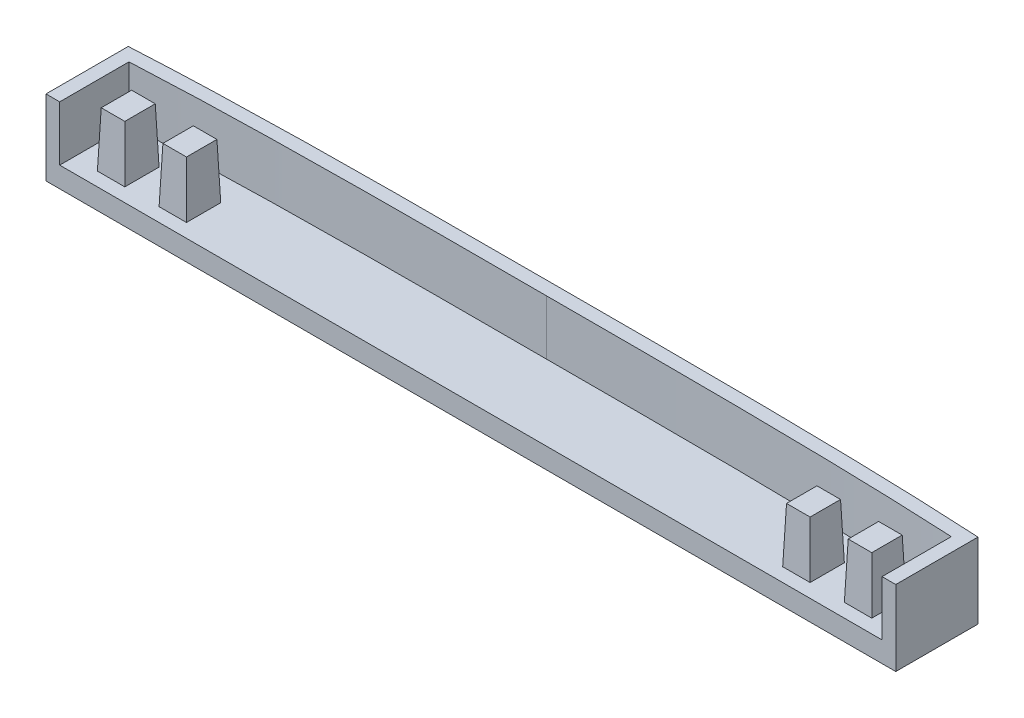
ISO-10303-21;
HEADER;
FILE_DESCRIPTION(('STEP AP214'),'2;1');
FILE_NAME('part.step','',(''),(''),'','','');
FILE_SCHEMA(('AUTOMOTIVE_DESIGN { 1 0 10303 214 1 1 1 1 }'));
ENDSEC;
DATA;
#1=APPLICATION_CONTEXT('core data for automotive mechanical design processes');
#2=APPLICATION_PROTOCOL_DEFINITION('international standard','automotive_design',2000,#1);
#3=PRODUCT_CONTEXT('',#1,'mechanical');
#4=PRODUCT('Part','Part','',(#3));
#5=PRODUCT_RELATED_PRODUCT_CATEGORY('part','',(#4));
#6=PRODUCT_DEFINITION_FORMATION('','',#4);
#7=PRODUCT_DEFINITION_CONTEXT('part definition',#1,'design');
#8=PRODUCT_DEFINITION('design','',#6,#7);
#9=PRODUCT_DEFINITION_SHAPE('','',#8);
#10=(LENGTH_UNIT() NAMED_UNIT(*) SI_UNIT(.MILLI.,.METRE.));
#11=(NAMED_UNIT(*) PLANE_ANGLE_UNIT() SI_UNIT($,.RADIAN.));
#12=(NAMED_UNIT(*) SI_UNIT($,.STERADIAN.) SOLID_ANGLE_UNIT());
#13=UNCERTAINTY_MEASURE_WITH_UNIT(LENGTH_MEASURE(1.E-05),#10,'distance_accuracy_value','');
#14=(GEOMETRIC_REPRESENTATION_CONTEXT(3) GLOBAL_UNCERTAINTY_ASSIGNED_CONTEXT((#13)) GLOBAL_UNIT_ASSIGNED_CONTEXT((#10,
#11,#12)) REPRESENTATION_CONTEXT('',''));
#15=CARTESIAN_POINT('',(0.,0.,0.));
#16=DIRECTION('',(0.,0.,1.));
#17=DIRECTION('',(1.,0.,0.));
#18=AXIS2_PLACEMENT_3D('',#15,#16,#17);
#19=CARTESIAN_POINT('',(-15.2954762235644,1.5,-6.45792529669851));
#20=DIRECTION('',(0.,1.,0.));
#21=DIRECTION('',(0.,0.,1.));
#22=AXIS2_PLACEMENT_3D('',#19,#20,#21);
#23=PLANE('',#22);
#24=DIRECTION('',(0.,0.,1.));
#25=VECTOR('',#24,1.);
#26=CARTESIAN_POINT('',(-30.,1.5,0.));
#27=LINE('',#26,#25);
#28=CARTESIAN_POINT('',(-30.,1.5,-5.05300690395027));
#29=VERTEX_POINT('',#28);
#30=CARTESIAN_POINT('',(-30.,1.5,0.));
#31=VERTEX_POINT('',#30);
#32=EDGE_CURVE('E408',#29,#31,#27,.T.);
#33=ORIENTED_EDGE('',*,*,#32,.T.);
#34=DIRECTION('',(-1.,0.,0.));
#35=VECTOR('',#34,1.);
#36=CARTESIAN_POINT('',(-30.,1.5,0.));
#37=LINE('',#36,#35);
#38=CARTESIAN_POINT('',(30.,1.5,0.));
#39=VERTEX_POINT('',#38);
#40=EDGE_CURVE('E401',#39,#31,#37,.T.);
#41=ORIENTED_EDGE('',*,*,#40,.F.);
#42=DIRECTION('',(0.,0.,-1.));
#43=VECTOR('',#42,1.);
#44=CARTESIAN_POINT('',(30.,1.5,0.));
#45=LINE('',#44,#43);
#46=CARTESIAN_POINT('',(30.,1.5,-5.05300690395027));
#47=VERTEX_POINT('',#46);
#48=EDGE_CURVE('E600',#39,#47,#45,.T.);
#49=ORIENTED_EDGE('',*,*,#48,.T.);
#50=CARTESIAN_POINT('',(30.,1.5,-5.05300690395027));
#51=CARTESIAN_POINT('',(29.6232980407042,1.5,-5.07265387252963));
#52=CARTESIAN_POINT('',(29.2465447851836,1.5,-5.09129270729749));
#53=CARTESIAN_POINT('',(28.4929531974639,1.5,-5.12672538045867));
#54=CARTESIAN_POINT('',(28.1161148656819,1.5,-5.14351922770714));
#55=CARTESIAN_POINT('',(26.9855117739003,1.5,-5.19138966924782));
#56=CARTESIAN_POINT('',(26.2316402548718,1.5,-5.21995611962589));
#57=CARTESIAN_POINT('',(24.7237960436403,1.5,-5.27147777957774));
#58=CARTESIAN_POINT('',(23.9698233731149,1.5,-5.2944336355481));
#59=CARTESIAN_POINT('',(22.461744786003,1.5,-5.33558882579871));
#60=CARTESIAN_POINT('',(21.7076388685329,1.5,-5.3537881272502));
#61=CARTESIAN_POINT('',(19.4453494050499,1.5,-5.40233176543027));
#62=CARTESIAN_POINT('',(17.9370352141215,1.5,-5.42662694769469));
#63=CARTESIAN_POINT('',(15.6744297417583,1.5,-5.45430549435337));
#64=CARTESIAN_POINT('',(14.9201840806281,1.5,-5.46207106841785));
#65=CARTESIAN_POINT('',(13.4116704608632,1.5,-5.47512736376247));
#66=CARTESIAN_POINT('',(12.6574025022247,1.5,-5.48041808461608));
#67=CARTESIAN_POINT('',(10.9111604434151,1.5,-5.49031099250601));
#68=CARTESIAN_POINT('',(9.91918234830561,1.5,-5.49417079135637));
#69=CARTESIAN_POINT('',(7.93521857787648,1.5,-5.49933276132543));
#70=CARTESIAN_POINT('',(6.94323290254634,1.5,-5.50063492780819));
#71=CARTESIAN_POINT('',(4.95937014869328,1.5,-5.50169301140521));
#72=CARTESIAN_POINT('',(3.96749307019953,1.5,-5.50144909819254));
#73=CARTESIAN_POINT('',(2.47968008228865,1.5,-5.50081831331378));
#74=CARTESIAN_POINT('',(1.98374405661157,1.5,-5.50056390011262));
#75=CARTESIAN_POINT('',(0.991872045339383,1.5,-5.50015747385048));
#76=CARTESIAN_POINT('',(0.495936059744291,1.5,-5.50000546077392));
#77=CARTESIAN_POINT('',(0.,1.5,-5.5));
#78=B_SPLINE_CURVE_WITH_KNOTS('',3,(#50,#51,#52,#53,#54,#55,#56,#57,#58,#59,#60,#61,#62,#63,#64,
#65,#66,#67,#68,#69,#70,#71,#72,#73,#74,#75,#76,#77),.UNSPECIFIED.,.F.,.F.,(4,2,2,2,2,2,2,2,2,2,
2,2,2,4),(0.,1.13163847193436,2.26327151224468,4.52648153383311,6.78943068794618,
9.05239546004916,13.5778479837032,15.8407030805466,18.1035585673908,21.0795107118779,
24.0554682505474,27.0310992011955,28.5189074845874,30.006715541544),.UNSPECIFIED.);
#79=CARTESIAN_POINT('',(0.,1.5,-5.5));
#80=VERTEX_POINT('',#79);
#81=EDGE_CURVE('E446',#47,#80,#78,.T.);
#82=ORIENTED_EDGE('',*,*,#81,.T.);
#83=CARTESIAN_POINT('',(0.,1.5,-5.5));
#84=CARTESIAN_POINT('',(-0.754204279511448,1.5,-5.50002788536174));
#85=CARTESIAN_POINT('',(-1.50840846300501,1.5,-5.50036349450039));
#86=CARTESIAN_POINT('',(-3.01681750470305,1.5,-5.50105026444585));
#87=CARTESIAN_POINT('',(-3.77102236290753,1.5,-5.50140142526667));
#88=CARTESIAN_POINT('',(-5.27947991986144,1.5,-5.50151940420532));
#89=CARTESIAN_POINT('',(-6.03373261862238,1.5,-5.50128618539688));
#90=CARTESIAN_POINT('',(-7.54223717497706,1.5,-5.499760152417));
#91=CARTESIAN_POINT('',(-8.2964890325708,1.5,-5.49846733821871));
#92=CARTESIAN_POINT('',(-9.8049967797207,1.5,-5.49437998246243));
#93=CARTESIAN_POINT('',(-10.5592526692377,1.5,-5.49158542535111));
#94=CARTESIAN_POINT('',(-12.0677543404704,1.5,-5.48407115406916));
#95=CARTESIAN_POINT('',(-12.8220001221967,1.5,-5.47935144210508));
#96=CARTESIAN_POINT('',(-14.3304411697333,1.5,-5.46755713596137));
#97=CARTESIAN_POINT('',(-15.0846364363177,1.5,-5.46048264359941));
#98=CARTESIAN_POINT('',(-16.5929992746815,1.5,-5.44352228697971));
#99=CARTESIAN_POINT('',(-17.3471668463157,1.5,-5.43363640964496));
#100=CARTESIAN_POINT('',(-19.0932055686142,1.5,-5.40691581678413));
#101=CARTESIAN_POINT('',(-20.0850587579115,1.5,-5.38887295508633));
#102=CARTESIAN_POINT('',(-22.0686061011535,1.5,-5.34573969271648));
#103=CARTESIAN_POINT('',(-23.0603002567394,1.5,-5.32064937017528));
#104=CARTESIAN_POINT('',(-24.5477207475729,1.5,-5.27646727541013));
#105=CARTESIAN_POINT('',(-25.0435448606046,1.5,-5.26064736796153));
#106=CARTESIAN_POINT('',(-26.0351083350196,1.5,-5.22656364850213));
#107=CARTESIAN_POINT('',(-26.5308476966237,1.5,-5.20829984295561));
#108=CARTESIAN_POINT('',(-27.5222389036597,1.5,-5.16903650723192));
#109=CARTESIAN_POINT('',(-28.0178907447721,1.5,-5.14803686710011));
#110=CARTESIAN_POINT('',(-29.0090576214853,1.5,-5.10293781222904));
#111=CARTESIAN_POINT('',(-29.504572655771,1.5,-5.07883836866203));
#112=CARTESIAN_POINT('',(-30.,1.5,-5.05300690395027));
#113=B_SPLINE_CURVE_WITH_KNOTS('',3,(#83,#84,#85,#86,#87,#88,#89,#90,#91,#92,#93,#94,#95,#96,
#97,#98,#99,#100,#101,#102,#103,#104,#105,#106,#107,#108,#109,#110,#111,#112),.UNSPECIFIED.,.F.,
.F.,(4,2,2,2,2,2,2,2,2,2,2,2,2,2,4),(0.,2.26261275440981,4.52522754800911,6.78798531724404,
9.05074314383125,11.3135244059297,13.5763030745085,15.8389839161692,18.1016752827412,
21.0777077795027,24.0537072841258,25.5419316332777,27.0301520460505,28.5184322896486,
30.0067263750507),.UNSPECIFIED.);
#114=EDGE_CURVE('E595',#80,#29,#113,.T.);
#115=ORIENTED_EDGE('',*,*,#114,.T.);
#116=EDGE_LOOP('',(#33,#41,#49,#82,#115));
#117=FACE_BOUND('',#116,.T.);
#118=DIRECTION('',(1.,0.,0.));
#119=VECTOR('',#118,1.);
#120=CARTESIAN_POINT('',(-28.25,1.5,-0.999999999999992));
#121=LINE('',#120,#119);
#122=CARTESIAN_POINT('',(-28.25,1.5,-0.999999999999992));
#123=VERTEX_POINT('',#122);
#124=CARTESIAN_POINT('',(-26.25,1.5,-0.999999999999993));
#125=VERTEX_POINT('',#124);
#126=EDGE_CURVE('E359',#123,#125,#121,.T.);
#127=ORIENTED_EDGE('',*,*,#126,.F.);
#128=DIRECTION('',(0.,0.,1.));
#129=VECTOR('',#128,1.);
#130=CARTESIAN_POINT('',(-28.25,1.5,-3.49999999999999));
#131=LINE('',#130,#129);
#132=CARTESIAN_POINT('',(-28.25,1.5,-3.49999999999999));
#133=VERTEX_POINT('',#132);
#134=EDGE_CURVE('E332',#133,#123,#131,.T.);
#135=ORIENTED_EDGE('',*,*,#134,.F.);
#136=DIRECTION('',(-1.,0.,0.));
#137=VECTOR('',#136,1.);
#138=CARTESIAN_POINT('',(-28.25,1.5,-3.49999999999999));
#139=LINE('',#138,#137);
#140=CARTESIAN_POINT('',(-26.25,1.5,-3.49999999999999));
#141=VERTEX_POINT('',#140);
#142=EDGE_CURVE('E366',#141,#133,#139,.T.);
#143=ORIENTED_EDGE('',*,*,#142,.F.);
#144=DIRECTION('',(0.,0.,-1.));
#145=VECTOR('',#144,1.);
#146=CARTESIAN_POINT('',(-26.25,1.5,-3.49999999999999));
#147=LINE('',#146,#145);
#148=EDGE_CURVE('E362',#125,#141,#147,.T.);
#149=ORIENTED_EDGE('',*,*,#148,.F.);
#150=EDGE_LOOP('',(#127,#135,#143,#149));
#151=FACE_BOUND('',#150,.T.);
#152=DIRECTION('',(1.,0.,0.));
#153=VECTOR('',#152,1.);
#154=CARTESIAN_POINT('',(-23.75,1.5,-0.999999999999992));
#155=LINE('',#154,#153);
#156=CARTESIAN_POINT('',(-23.75,1.5,-0.999999999999992));
#157=VERTEX_POINT('',#156);
#158=CARTESIAN_POINT('',(-21.75,1.5,-0.999999999999992));
#159=VERTEX_POINT('',#158);
#160=EDGE_CURVE('E318',#157,#159,#155,.T.);
#161=ORIENTED_EDGE('',*,*,#160,.F.);
#162=DIRECTION('',(0.,0.,1.));
#163=VECTOR('',#162,1.);
#164=CARTESIAN_POINT('',(-23.75,1.5,-3.49999999999999));
#165=LINE('',#164,#163);
#166=CARTESIAN_POINT('',(-23.75,1.5,-3.49999999999999));
#167=VERTEX_POINT('',#166);
#168=EDGE_CURVE('E292',#167,#157,#165,.T.);
#169=ORIENTED_EDGE('',*,*,#168,.F.);
#170=DIRECTION('',(-1.,0.,0.));
#171=VECTOR('',#170,1.);
#172=CARTESIAN_POINT('',(-23.75,1.5,-3.49999999999999));
#173=LINE('',#172,#171);
#174=CARTESIAN_POINT('',(-21.75,1.5,-3.49999999999999));
#175=VERTEX_POINT('',#174);
#176=EDGE_CURVE('E325',#175,#167,#173,.T.);
#177=ORIENTED_EDGE('',*,*,#176,.F.);
#178=DIRECTION('',(0.,0.,-1.));
#179=VECTOR('',#178,1.);
#180=CARTESIAN_POINT('',(-21.75,1.5,-3.49999999999999));
#181=LINE('',#180,#179);
#182=EDGE_CURVE('E321',#159,#175,#181,.T.);
#183=ORIENTED_EDGE('',*,*,#182,.F.);
#184=EDGE_LOOP('',(#161,#169,#177,#183));
#185=FACE_BOUND('',#184,.T.);
#186=DIRECTION('',(0.,0.,1.));
#187=VECTOR('',#186,1.);
#188=CARTESIAN_POINT('',(21.75,1.5,-3.5));
#189=LINE('',#188,#187);
#190=CARTESIAN_POINT('',(21.75,1.5,-3.5));
#191=VERTEX_POINT('',#190);
#192=CARTESIAN_POINT('',(21.75,1.5,-0.999999999999998));
#193=VERTEX_POINT('',#192);
#194=EDGE_CURVE('E279',#191,#193,#189,.T.);
#195=ORIENTED_EDGE('',*,*,#194,.F.);
#196=DIRECTION('',(-1.,0.,0.));
#197=VECTOR('',#196,1.);
#198=CARTESIAN_POINT('',(23.75,1.5,-3.5));
#199=LINE('',#198,#197);
#200=CARTESIAN_POINT('',(23.75,1.5,-3.5));
#201=VERTEX_POINT('',#200);
#202=EDGE_CURVE('E236',#201,#191,#199,.T.);
#203=ORIENTED_EDGE('',*,*,#202,.F.);
#204=DIRECTION('',(0.,0.,-1.));
#205=VECTOR('',#204,1.);
#206=CARTESIAN_POINT('',(23.75,1.5,-3.5));
#207=LINE('',#206,#205);
#208=CARTESIAN_POINT('',(23.75,1.5,-0.999999999999998));
#209=VERTEX_POINT('',#208);
#210=EDGE_CURVE('E285',#209,#201,#207,.T.);
#211=ORIENTED_EDGE('',*,*,#210,.F.);
#212=DIRECTION('',(1.,0.,0.));
#213=VECTOR('',#212,1.);
#214=CARTESIAN_POINT('',(23.75,1.5,-0.999999999999998));
#215=LINE('',#214,#213);
#216=EDGE_CURVE('E282',#193,#209,#215,.T.);
#217=ORIENTED_EDGE('',*,*,#216,.F.);
#218=EDGE_LOOP('',(#195,#203,#211,#217));
#219=FACE_BOUND('',#218,.T.);
#220=DIRECTION('',(0.,0.,1.));
#221=VECTOR('',#220,1.);
#222=CARTESIAN_POINT('',(26.25,1.5,-3.5));
#223=LINE('',#222,#221);
#224=CARTESIAN_POINT('',(26.25,1.5,-3.5));
#225=VERTEX_POINT('',#224);
#226=CARTESIAN_POINT('',(26.25,1.5,-0.999999999999999));
#227=VERTEX_POINT('',#226);
#228=EDGE_CURVE('E229',#225,#227,#223,.T.);
#229=ORIENTED_EDGE('',*,*,#228,.F.);
#230=DIRECTION('',(-1.,0.,0.));
#231=VECTOR('',#230,1.);
#232=CARTESIAN_POINT('',(28.25,1.5,-3.49999999999999));
#233=LINE('',#232,#231);
#234=CARTESIAN_POINT('',(28.25,1.5,-3.49999999999999));
#235=VERTEX_POINT('',#234);
#236=EDGE_CURVE('E241',#235,#225,#233,.T.);
#237=ORIENTED_EDGE('',*,*,#236,.F.);
#238=DIRECTION('',(0.,0.,-1.));
#239=VECTOR('',#238,1.);
#240=CARTESIAN_POINT('',(28.25,1.5,-3.49999999999999));
#241=LINE('',#240,#239);
#242=CARTESIAN_POINT('',(28.25,1.5,-0.999999999999992));
#243=VERTEX_POINT('',#242);
#244=EDGE_CURVE('E254',#243,#235,#241,.T.);
#245=ORIENTED_EDGE('',*,*,#244,.F.);
#246=DIRECTION('',(1.,0.,0.));
#247=VECTOR('',#246,1.);
#248=CARTESIAN_POINT('',(28.25,1.5,-0.999999999999992));
#249=LINE('',#248,#247);
#250=EDGE_CURVE('E250',#227,#243,#249,.T.);
#251=ORIENTED_EDGE('',*,*,#250,.F.);
#252=EDGE_LOOP('',(#229,#237,#245,#251));
#253=FACE_BOUND('',#252,.T.);
#254=ADVANCED_FACE('F49',(#117,#151,#185,#219,#253),#23,.T.);
#255=CARTESIAN_POINT('',(-31.,5.5,0.));
#256=DIRECTION('',(1.,0.,0.));
#257=DIRECTION('',(0.,0.,-1.));
#258=AXIS2_PLACEMENT_3D('',#255,#256,#257);
#259=PLANE('',#258);
#260=DIRECTION('',(0.,0.,1.));
#261=VECTOR('',#260,1.);
#262=CARTESIAN_POINT('',(-31.,0.,0.));
#263=LINE('',#262,#261);
#264=CARTESIAN_POINT('',(-31.,0.,-5.99999999999999));
#265=VERTEX_POINT('',#264);
#266=CARTESIAN_POINT('',(-31.,0.,0.));
#267=VERTEX_POINT('',#266);
#268=EDGE_CURVE('E620',#265,#267,#263,.T.);
#269=ORIENTED_EDGE('',*,*,#268,.T.);
#270=DIRECTION('',(0.,-1.,0.));
#271=VECTOR('',#270,1.);
#272=CARTESIAN_POINT('',(-31.,5.5,0.));
#273=LINE('',#272,#271);
#274=CARTESIAN_POINT('',(-31.,5.5,0.));
#275=VERTEX_POINT('',#274);
#276=EDGE_CURVE('E11',#275,#267,#273,.T.);
#277=ORIENTED_EDGE('',*,*,#276,.F.);
#278=DIRECTION('',(0.,0.,1.));
#279=VECTOR('',#278,1.);
#280=CARTESIAN_POINT('',(-31.,5.5,0.));
#281=LINE('',#280,#279);
#282=CARTESIAN_POINT('',(-31.,5.5,-5.99999999999999));
#283=VERTEX_POINT('',#282);
#284=EDGE_CURVE('E918',#283,#275,#281,.T.);
#285=ORIENTED_EDGE('',*,*,#284,.F.);
#286=DIRECTION('',(0.,-1.,0.));
#287=VECTOR('',#286,1.);
#288=CARTESIAN_POINT('',(-31.,5.5,-5.99999999999999));
#289=LINE('',#288,#287);
#290=EDGE_CURVE('E911',#283,#265,#289,.T.);
#291=ORIENTED_EDGE('',*,*,#290,.T.);
#292=EDGE_LOOP('',(#269,#277,#285,#291));
#293=FACE_BOUND('',#292,.T.);
#294=ADVANCED_FACE('F51',(#293),#259,.F.);
#295=CARTESIAN_POINT('',(31.,5.5,0.));
#296=DIRECTION('',(0.,0.,-1.));
#297=DIRECTION('',(-1.,0.,0.));
#298=AXIS2_PLACEMENT_3D('',#295,#296,#297);
#299=PLANE('',#298);
#300=ORIENTED_EDGE('',*,*,#40,.T.);
#301=DIRECTION('',(0.,1.,0.));
#302=VECTOR('',#301,1.);
#303=CARTESIAN_POINT('',(-30.,-58.5187470712277,0.));
#304=LINE('',#303,#302);
#305=CARTESIAN_POINT('',(-30.,5.5,0.));
#306=VERTEX_POINT('',#305);
#307=EDGE_CURVE('E373',#31,#306,#304,.T.);
#308=ORIENTED_EDGE('',*,*,#307,.T.);
#309=DIRECTION('',(1.,0.,0.));
#310=VECTOR('',#309,1.);
#311=CARTESIAN_POINT('',(31.,5.5,0.));
#312=LINE('',#311,#310);
#313=EDGE_CURVE('E930',#275,#306,#312,.T.);
#314=ORIENTED_EDGE('',*,*,#313,.F.);
#315=ORIENTED_EDGE('',*,*,#276,.T.);
#316=DIRECTION('',(1.,0.,0.));
#317=VECTOR('',#316,1.);
#318=CARTESIAN_POINT('',(31.,0.,0.));
#319=LINE('',#318,#317);
#320=CARTESIAN_POINT('',(31.,0.,0.));
#321=VERTEX_POINT('',#320);
#322=EDGE_CURVE('E625',#267,#321,#319,.T.);
#323=ORIENTED_EDGE('',*,*,#322,.T.);
#324=DIRECTION('',(0.,-1.,0.));
#325=VECTOR('',#324,1.);
#326=CARTESIAN_POINT('',(31.,5.5,0.));
#327=LINE('',#326,#325);
#328=CARTESIAN_POINT('',(31.,5.5,0.));
#329=VERTEX_POINT('',#328);
#330=EDGE_CURVE('E58',#329,#321,#327,.T.);
#331=ORIENTED_EDGE('',*,*,#330,.F.);
#332=CARTESIAN_POINT('',(30.,5.5,0.));
#333=VERTEX_POINT('',#332);
#334=EDGE_CURVE('E608',#333,#329,#312,.T.);
#335=ORIENTED_EDGE('',*,*,#334,.F.);
#336=DIRECTION('',(0.,1.,0.));
#337=VECTOR('',#336,1.);
#338=CARTESIAN_POINT('',(30.,-58.5187470712277,0.));
#339=LINE('',#338,#337);
#340=EDGE_CURVE('E397',#39,#333,#339,.T.);
#341=ORIENTED_EDGE('',*,*,#340,.F.);
#342=EDGE_LOOP('',(#300,#308,#314,#315,#323,#331,#335,#341));
#343=FACE_BOUND('',#342,.T.);
#344=ADVANCED_FACE('F554',(#343),#299,.F.);
#345=CARTESIAN_POINT('',(31.,5.5,0.));
#346=DIRECTION('',(-1.,0.,0.));
#347=DIRECTION('',(0.,0.,1.));
#348=AXIS2_PLACEMENT_3D('',#345,#346,#347);
#349=PLANE('',#348);
#350=DIRECTION('',(0.,0.,-1.));
#351=VECTOR('',#350,1.);
#352=CARTESIAN_POINT('',(31.,0.,0.));
#353=LINE('',#352,#351);
#354=CARTESIAN_POINT('',(31.,0.,-6.));
#355=VERTEX_POINT('',#354);
#356=EDGE_CURVE('E926',#321,#355,#353,.T.);
#357=ORIENTED_EDGE('',*,*,#356,.T.);
#358=DIRECTION('',(0.,-1.,0.));
#359=VECTOR('',#358,1.);
#360=CARTESIAN_POINT('',(31.,5.5,-6.));
#361=LINE('',#360,#359);
#362=CARTESIAN_POINT('',(31.,5.5,-6.));
#363=VERTEX_POINT('',#362);
#364=EDGE_CURVE('E954',#363,#355,#361,.T.);
#365=ORIENTED_EDGE('',*,*,#364,.F.);
#366=DIRECTION('',(0.,0.,-1.));
#367=VECTOR('',#366,1.);
#368=CARTESIAN_POINT('',(31.,5.5,0.));
#369=LINE('',#368,#367);
#370=EDGE_CURVE('E416',#329,#363,#369,.T.);
#371=ORIENTED_EDGE('',*,*,#370,.F.);
#372=ORIENTED_EDGE('',*,*,#330,.T.);
#373=EDGE_LOOP('',(#357,#365,#371,#372));
#374=FACE_BOUND('',#373,.T.);
#375=ADVANCED_FACE('F431',(#374),#349,.F.);
#376=CARTESIAN_POINT('',(31.,5.5,-6.));
#377=CARTESIAN_POINT('',(21.2515523068222,5.5,-6.55446745786269));
#378=CARTESIAN_POINT('',(9.20305095601617,5.5,-6.5));
#379=CARTESIAN_POINT('',(0.,5.5,-6.5));
#380=B_SPLINE_CURVE_WITH_KNOTS('',3,(#376,#377,#378,#379),.UNSPECIFIED.,.F.,.F.,(4,4),(0.,1.),.UNSPECIFIED.);
#381=DIRECTION('',(0.,-1.,0.));
#382=VECTOR('',#381,1.);
#383=SURFACE_OF_LINEAR_EXTRUSION('',#380,#382);
#384=CARTESIAN_POINT('',(31.,0.,-6.));
#385=CARTESIAN_POINT('',(21.2515523068222,0.,-6.55446745786269));
#386=CARTESIAN_POINT('',(9.20305095601617,0.,-6.5));
#387=CARTESIAN_POINT('',(0.,0.,-6.5));
#388=B_SPLINE_CURVE_WITH_KNOTS('',3,(#384,#385,#386,#387),.UNSPECIFIED.,.F.,.F.,(4,4),(0.,1.),.UNSPECIFIED.);
#389=CARTESIAN_POINT('',(0.,0.,-6.5));
#390=VERTEX_POINT('',#389);
#391=EDGE_CURVE('E919',#355,#390,#388,.T.);
#392=ORIENTED_EDGE('',*,*,#391,.T.);
#393=DIRECTION('',(0.,-1.,0.));
#394=VECTOR('',#393,1.);
#395=CARTESIAN_POINT('',(0.,5.5,-6.5));
#396=LINE('',#395,#394);
#397=CARTESIAN_POINT('',(0.,5.5,-6.5));
#398=VERTEX_POINT('',#397);
#399=EDGE_CURVE('E914',#398,#390,#396,.T.);
#400=ORIENTED_EDGE('',*,*,#399,.F.);
#401=EDGE_CURVE('E409',#363,#398,#380,.T.);
#402=ORIENTED_EDGE('',*,*,#401,.F.);
#403=ORIENTED_EDGE('',*,*,#364,.T.);
#404=EDGE_LOOP('',(#392,#400,#402,#403));
#405=FACE_BOUND('',#404,.T.);
#406=ADVANCED_FACE('F425',(#405),#383,.F.);
#407=CARTESIAN_POINT('',(0.,5.5,-6.5));
#408=CARTESIAN_POINT('',(-9.20305095601617,5.5,-6.5));
#409=CARTESIAN_POINT('',(-21.2515523068222,5.5,-6.55446745786269));
#410=CARTESIAN_POINT('',(-31.,5.5,-5.99999999999999));
#411=B_SPLINE_CURVE_WITH_KNOTS('',3,(#407,#408,#409,#410),.UNSPECIFIED.,.F.,.F.,(4,4),(0.,1.),.UNSPECIFIED.);
#412=DIRECTION('',(0.,-1.,0.));
#413=VECTOR('',#412,1.);
#414=SURFACE_OF_LINEAR_EXTRUSION('',#411,#413);
#415=CARTESIAN_POINT('',(0.,0.,-6.5));
#416=CARTESIAN_POINT('',(-9.20305095601617,0.,-6.5));
#417=CARTESIAN_POINT('',(-21.2515523068222,0.,-6.55446745786269));
#418=CARTESIAN_POINT('',(-31.,0.,-5.99999999999999));
#419=B_SPLINE_CURVE_WITH_KNOTS('',3,(#415,#416,#417,#418),.UNSPECIFIED.,.F.,.F.,(4,4),(0.,1.),.UNSPECIFIED.);
#420=EDGE_CURVE('E908',#390,#265,#419,.T.);
#421=ORIENTED_EDGE('',*,*,#420,.T.);
#422=ORIENTED_EDGE('',*,*,#290,.F.);
#423=EDGE_CURVE('E415',#398,#283,#411,.T.);
#424=ORIENTED_EDGE('',*,*,#423,.F.);
#425=ORIENTED_EDGE('',*,*,#399,.T.);
#426=EDGE_LOOP('',(#421,#422,#424,#425));
#427=FACE_BOUND('',#426,.T.);
#428=ADVANCED_FACE('F430',(#427),#414,.F.);
#429=CARTESIAN_POINT('',(-15.2954762235644,5.5,-6.45792529669851));
#430=DIRECTION('',(0.,1.,0.));
#431=DIRECTION('',(0.,0.,1.));
#432=AXIS2_PLACEMENT_3D('',#429,#430,#431);
#433=PLANE('',#432);
#434=ORIENTED_EDGE('',*,*,#313,.T.);
#435=DIRECTION('',(0.,0.,1.));
#436=VECTOR('',#435,1.);
#437=CARTESIAN_POINT('',(-30.,5.5,0.));
#438=LINE('',#437,#436);
#439=CARTESIAN_POINT('',(-30.,5.5,-5.05300690395027));
#440=VERTEX_POINT('',#439);
#441=EDGE_CURVE('E603',#440,#306,#438,.T.);
#442=ORIENTED_EDGE('',*,*,#441,.F.);
#443=CARTESIAN_POINT('',(0.,5.5,-5.5));
#444=CARTESIAN_POINT('',(-0.75420427951145,5.5,-5.50002788536174));
#445=CARTESIAN_POINT('',(-1.50840846300501,5.5,-5.50036349450039));
#446=CARTESIAN_POINT('',(-3.01681750470305,5.5,-5.50105026444585));
#447=CARTESIAN_POINT('',(-3.77102236290753,5.5,-5.50140142526667));
#448=CARTESIAN_POINT('',(-5.27947991986144,5.5,-5.50151940420532));
#449=CARTESIAN_POINT('',(-6.03373261862238,5.5,-5.50128618539688));
#450=CARTESIAN_POINT('',(-7.54223717497706,5.5,-5.499760152417));
#451=CARTESIAN_POINT('',(-8.2964890325708,5.5,-5.49846733821871));
#452=CARTESIAN_POINT('',(-9.8049967797207,5.5,-5.49437998246243));
#453=CARTESIAN_POINT('',(-10.5592526692377,5.5,-5.49158542535111));
#454=CARTESIAN_POINT('',(-12.0677543404704,5.5,-5.48407115406916));
#455=CARTESIAN_POINT('',(-12.8220001221967,5.5,-5.47935144210508));
#456=CARTESIAN_POINT('',(-14.3304411697333,5.5,-5.46755713596137));
#457=CARTESIAN_POINT('',(-15.0846364363177,5.5,-5.46048264359941));
#458=CARTESIAN_POINT('',(-16.5929992746815,5.5,-5.44352228697971));
#459=CARTESIAN_POINT('',(-17.3471668463157,5.5,-5.43363640964496));
#460=CARTESIAN_POINT('',(-19.0932055686142,5.5,-5.40691581678413));
#461=CARTESIAN_POINT('',(-20.0850587579115,5.5,-5.38887295508633));
#462=CARTESIAN_POINT('',(-22.0686061011535,5.5,-5.34573969271648));
#463=CARTESIAN_POINT('',(-23.0603002567394,5.5,-5.32064937017528));
#464=CARTESIAN_POINT('',(-24.5477207475729,5.5,-5.27646727541013));
#465=CARTESIAN_POINT('',(-25.0435448606046,5.5,-5.26064736796153));
#466=CARTESIAN_POINT('',(-26.0351083350196,5.5,-5.22656364850213));
#467=CARTESIAN_POINT('',(-26.5308476966237,5.5,-5.20829984295561));
#468=CARTESIAN_POINT('',(-27.5222389036597,5.5,-5.16903650723192));
#469=CARTESIAN_POINT('',(-28.0178907447721,5.5,-5.14803686710011));
#470=CARTESIAN_POINT('',(-29.0090576214853,5.5,-5.10293781222904));
#471=CARTESIAN_POINT('',(-29.504572655771,5.5,-5.07883836866203));
#472=CARTESIAN_POINT('',(-30.,5.5,-5.05300690395027));
#473=B_SPLINE_CURVE_WITH_KNOTS('',3,(#443,#444,#445,#446,#447,#448,#449,#450,#451,#452,#453,
#454,#455,#456,#457,#458,#459,#460,#461,#462,#463,#464,#465,#466,#467,#468,#469,#470,#471,#472),
.UNSPECIFIED.,.F.,.F.,(4,2,2,2,2,2,2,2,2,2,2,2,2,2,4),(0.,2.26261275440981,4.52522754800911,
6.78798531724404,9.05074314383125,11.3135244059297,13.5763030745085,15.8389839161692,
18.1016752827412,21.0777077795027,24.0537072841258,25.5419316332777,27.0301520460505,
28.5184322896486,30.0067263750507),.UNSPECIFIED.);
#474=CARTESIAN_POINT('',(0.,5.5,-5.5));
#475=VERTEX_POINT('',#474);
#476=EDGE_CURVE('E463',#475,#440,#473,.T.);
#477=ORIENTED_EDGE('',*,*,#476,.F.);
#478=CARTESIAN_POINT('',(30.,5.5,-5.05300690395027));
#479=CARTESIAN_POINT('',(29.6232980407042,5.5,-5.07265387252963));
#480=CARTESIAN_POINT('',(29.2465447851836,5.5,-5.0912927072975));
#481=CARTESIAN_POINT('',(28.4929531974639,5.5,-5.12672538045867));
#482=CARTESIAN_POINT('',(28.1161148656819,5.5,-5.14351922770714));
#483=CARTESIAN_POINT('',(26.9855117739003,5.5,-5.19138966924781));
#484=CARTESIAN_POINT('',(26.2316402548718,5.5,-5.21995611962589));
#485=CARTESIAN_POINT('',(24.7237960436404,5.5,-5.27147777957774));
#486=CARTESIAN_POINT('',(23.9698233731149,5.5,-5.2944336355481));
#487=CARTESIAN_POINT('',(22.461744786003,5.5,-5.33558882579871));
#488=CARTESIAN_POINT('',(21.7076388685329,5.5,-5.3537881272502));
#489=CARTESIAN_POINT('',(19.4453494050499,5.5,-5.40233176543027));
#490=CARTESIAN_POINT('',(17.9370352141215,5.5,-5.42662694769469));
#491=CARTESIAN_POINT('',(15.6744297417583,5.5,-5.45430549435337));
#492=CARTESIAN_POINT('',(14.9201840806281,5.5,-5.46207106841785));
#493=CARTESIAN_POINT('',(13.4116704608632,5.5,-5.47512736376247));
#494=CARTESIAN_POINT('',(12.6574025022247,5.5,-5.48041808461608));
#495=CARTESIAN_POINT('',(10.9111604434151,5.5,-5.490310992506));
#496=CARTESIAN_POINT('',(9.91918234830561,5.5,-5.49417079135637));
#497=CARTESIAN_POINT('',(7.93521857787649,5.5,-5.49933276132543));
#498=CARTESIAN_POINT('',(6.94323290254635,5.5,-5.50063492780819));
#499=CARTESIAN_POINT('',(4.95937014869329,5.5,-5.50169301140521));
#500=CARTESIAN_POINT('',(3.96749307019954,5.5,-5.50144909819254));
#501=CARTESIAN_POINT('',(2.47968008228866,5.5,-5.50081831331378));
#502=CARTESIAN_POINT('',(1.98374405661157,5.5,-5.50056390011262));
#503=CARTESIAN_POINT('',(0.991872045339385,5.5,-5.50015747385048));
#504=CARTESIAN_POINT('',(0.495936059744291,5.5,-5.50000546077392));
#505=CARTESIAN_POINT('',(0.,5.5,-5.5));
#506=B_SPLINE_CURVE_WITH_KNOTS('',3,(#478,#479,#480,#481,#482,#483,#484,#485,#486,#487,#488,
#489,#490,#491,#492,#493,#494,#495,#496,#497,#498,#499,#500,#501,#502,#503,#504,#505),
.UNSPECIFIED.,.F.,.F.,(4,2,2,2,2,2,2,2,2,2,2,2,2,4),(0.,1.13163847193436,2.26327151224468,
4.5264815338331,6.78943068794617,9.05239546004915,13.5778479837032,15.8407030805466,
18.1035585673908,21.0795107118779,24.0554682505474,27.0310992011955,28.5189074845874,
30.006715541544),.UNSPECIFIED.);
#507=CARTESIAN_POINT('',(30.,5.5,-5.05300690395027));
#508=VERTEX_POINT('',#507);
#509=EDGE_CURVE('E454',#508,#475,#506,.T.);
#510=ORIENTED_EDGE('',*,*,#509,.F.);
#511=DIRECTION('',(0.,0.,-1.));
#512=VECTOR('',#511,1.);
#513=CARTESIAN_POINT('',(30.,5.5,0.));
#514=LINE('',#513,#512);
#515=EDGE_CURVE('E464',#333,#508,#514,.T.);
#516=ORIENTED_EDGE('',*,*,#515,.F.);
#517=ORIENTED_EDGE('',*,*,#334,.T.);
#518=ORIENTED_EDGE('',*,*,#370,.T.);
#519=ORIENTED_EDGE('',*,*,#401,.T.);
#520=ORIENTED_EDGE('',*,*,#423,.T.);
#521=ORIENTED_EDGE('',*,*,#284,.T.);
#522=EDGE_LOOP('',(#434,#442,#477,#510,#516,#517,#518,#519,#520,#521));
#523=FACE_BOUND('',#522,.T.);
#524=ADVANCED_FACE('F645',(#523),#433,.T.);
#525=CARTESIAN_POINT('',(-15.2954762235644,0.,-6.45792529669851));
#526=DIRECTION('',(0.,1.,0.));
#527=DIRECTION('',(0.,0.,1.));
#528=AXIS2_PLACEMENT_3D('',#525,#526,#527);
#529=PLANE('',#528);
#530=ORIENTED_EDGE('',*,*,#268,.F.);
#531=ORIENTED_EDGE('',*,*,#420,.F.);
#532=ORIENTED_EDGE('',*,*,#391,.F.);
#533=ORIENTED_EDGE('',*,*,#356,.F.);
#534=ORIENTED_EDGE('',*,*,#322,.F.);
#535=EDGE_LOOP('',(#530,#531,#532,#533,#534));
#536=FACE_BOUND('',#535,.T.);
#537=ADVANCED_FACE('F642',(#536),#529,.F.);
#538=CARTESIAN_POINT('',(-30.,5.5,0.));
#539=DIRECTION('',(1.,0.,0.));
#540=DIRECTION('',(0.,0.,-1.));
#541=AXIS2_PLACEMENT_3D('',#538,#539,#540);
#542=PLANE('',#541);
#543=ORIENTED_EDGE('',*,*,#32,.F.);
#544=DIRECTION('',(0.,-1.,0.));
#545=VECTOR('',#544,1.);
#546=CARTESIAN_POINT('',(-30.,5.5,-5.05300690395027));
#547=LINE('',#546,#545);
#548=EDGE_CURVE('E618',#440,#29,#547,.T.);
#549=ORIENTED_EDGE('',*,*,#548,.F.);
#550=ORIENTED_EDGE('',*,*,#441,.T.);
#551=ORIENTED_EDGE('',*,*,#307,.F.);
#552=EDGE_LOOP('',(#543,#549,#550,#551));
#553=FACE_BOUND('',#552,.T.);
#554=ADVANCED_FACE('F601',(#553),#542,.T.);
#555=CARTESIAN_POINT('',(30.,5.5,0.));
#556=DIRECTION('',(-1.,0.,0.));
#557=DIRECTION('',(0.,0.,1.));
#558=AXIS2_PLACEMENT_3D('',#555,#556,#557);
#559=PLANE('',#558);
#560=ORIENTED_EDGE('',*,*,#48,.F.);
#561=ORIENTED_EDGE('',*,*,#340,.T.);
#562=ORIENTED_EDGE('',*,*,#515,.T.);
#563=DIRECTION('',(0.,-1.,0.));
#564=VECTOR('',#563,1.);
#565=CARTESIAN_POINT('',(30.,5.5,-5.05300690395027));
#566=LINE('',#565,#564);
#567=EDGE_CURVE('E612',#508,#47,#566,.T.);
#568=ORIENTED_EDGE('',*,*,#567,.T.);
#569=EDGE_LOOP('',(#560,#561,#562,#568));
#570=FACE_BOUND('',#569,.T.);
#571=ADVANCED_FACE('F440',(#570),#559,.T.);
#572=CARTESIAN_POINT('',(31.,5.5,-6.));
#573=CARTESIAN_POINT('',(21.2515523068222,5.5,-6.55446745786269));
#574=CARTESIAN_POINT('',(9.20305095601617,5.5,-6.5));
#575=CARTESIAN_POINT('',(0.,5.5,-6.5));
#576=B_SPLINE_CURVE_WITH_KNOTS('',3,(#572,#573,#574,#575),.UNSPECIFIED.,.F.,.F.,(4,4),(0.,1.),.UNSPECIFIED.);
#577=DIRECTION('',(0.,-1.,0.));
#578=VECTOR('',#577,1.);
#579=SURFACE_OF_LINEAR_EXTRUSION('',#576,#578);
#580=OFFSET_SURFACE('',#579,0.999999999999999,.F.);
#581=ORIENTED_EDGE('',*,*,#81,.F.);
#582=ORIENTED_EDGE('',*,*,#567,.F.);
#583=ORIENTED_EDGE('',*,*,#509,.T.);
#584=DIRECTION('',(0.,-1.,0.));
#585=VECTOR('',#584,1.);
#586=CARTESIAN_POINT('',(0.,5.5,-5.5));
#587=LINE('',#586,#585);
#588=EDGE_CURVE('E621',#475,#80,#587,.T.);
#589=ORIENTED_EDGE('',*,*,#588,.T.);
#590=EDGE_LOOP('',(#581,#582,#583,#589));
#591=FACE_BOUND('',#590,.T.);
#592=ADVANCED_FACE('F435',(#591),#580,.T.);
#593=CARTESIAN_POINT('',(0.,5.5,-6.5));
#594=CARTESIAN_POINT('',(-9.20305095601617,5.5,-6.5));
#595=CARTESIAN_POINT('',(-21.2515523068222,5.5,-6.55446745786269));
#596=CARTESIAN_POINT('',(-31.,5.5,-5.99999999999999));
#597=B_SPLINE_CURVE_WITH_KNOTS('',3,(#593,#594,#595,#596),.UNSPECIFIED.,.F.,.F.,(4,4),(0.,1.),.UNSPECIFIED.);
#598=DIRECTION('',(0.,-1.,0.));
#599=VECTOR('',#598,1.);
#600=SURFACE_OF_LINEAR_EXTRUSION('',#597,#599);
#601=OFFSET_SURFACE('',#600,0.999999999999999,.F.);
#602=ORIENTED_EDGE('',*,*,#114,.F.);
#603=ORIENTED_EDGE('',*,*,#588,.F.);
#604=ORIENTED_EDGE('',*,*,#476,.T.);
#605=ORIENTED_EDGE('',*,*,#548,.T.);
#606=EDGE_LOOP('',(#602,#603,#604,#605));
#607=FACE_BOUND('',#606,.T.);
#608=ADVANCED_FACE('F439',(#607),#601,.T.);
#609=CARTESIAN_POINT('',(-28.25,1.5,-3.49999999999999));
#610=DIRECTION('',(-0.999390827019096,0.034899496702501,0.));
#611=DIRECTION('',(-0.034899496702501,-0.999390827019096,0.));
#612=AXIS2_PLACEMENT_3D('',#609,#610,#611);
#613=PLANE('',#612);
#614=ORIENTED_EDGE('',*,*,#134,.T.);
#615=DIRECTION('',(-0.0348782627423747,-0.998782765958718,0.0348782627423747));
#616=VECTOR('',#615,1.);
#617=CARTESIAN_POINT('',(-28.25,1.5,-0.999999999999992));
#618=LINE('',#617,#616);
#619=CARTESIAN_POINT('',(-28.110316922033,5.5,-1.13968307796698));
#620=VERTEX_POINT('',#619);
#621=EDGE_CURVE('E370',#620,#123,#618,.T.);
#622=ORIENTED_EDGE('',*,*,#621,.F.);
#623=DIRECTION('',(0.,0.,-1.));
#624=VECTOR('',#623,1.);
#625=CARTESIAN_POINT('',(-28.110316922033,5.5,-3.49999999999999));
#626=LINE('',#625,#624);
#627=CARTESIAN_POINT('',(-28.110316922033,5.5,-3.360316922033));
#628=VERTEX_POINT('',#627);
#629=EDGE_CURVE('E369',#628,#620,#626,.F.);
#630=ORIENTED_EDGE('',*,*,#629,.F.);
#631=DIRECTION('',(-0.0348782627423747,-0.998782765958718,-0.0348782627423747));
#632=VECTOR('',#631,1.);
#633=CARTESIAN_POINT('',(-28.25,1.5,-3.49999999999999));
#634=LINE('',#633,#632);
#635=EDGE_CURVE('E375',#628,#133,#634,.T.);
#636=ORIENTED_EDGE('',*,*,#635,.T.);
#637=EDGE_LOOP('',(#614,#622,#630,#636));
#638=FACE_BOUND('',#637,.T.);
#639=ADVANCED_FACE('F478',(#638),#613,.T.);
#640=CARTESIAN_POINT('',(-28.25,1.5,-0.999999999999992));
#641=DIRECTION('',(0.,0.034899496702501,0.999390827019096));
#642=DIRECTION('',(0.,-0.999390827019096,0.034899496702501));
#643=AXIS2_PLACEMENT_3D('',#640,#641,#642);
#644=PLANE('',#643);
#645=ORIENTED_EDGE('',*,*,#126,.T.);
#646=DIRECTION('',(0.0348782627423747,-0.998782765958718,0.0348782627423747));
#647=VECTOR('',#646,1.);
#648=CARTESIAN_POINT('',(-26.2530412330298,1.58708951933416,-1.00304123302981));
#649=LINE('',#648,#647);
#650=CARTESIAN_POINT('',(-26.389683077967,5.5,-1.13968307796698));
#651=VERTEX_POINT('',#650);
#652=EDGE_CURVE('E374',#651,#125,#649,.T.);
#653=ORIENTED_EDGE('',*,*,#652,.F.);
#654=DIRECTION('',(-1.,0.,0.));
#655=VECTOR('',#654,1.);
#656=CARTESIAN_POINT('',(-28.25,5.5,-1.13968307796698));
#657=LINE('',#656,#655);
#658=EDGE_CURVE('E389',#620,#651,#657,.F.);
#659=ORIENTED_EDGE('',*,*,#658,.F.);
#660=ORIENTED_EDGE('',*,*,#621,.T.);
#661=EDGE_LOOP('',(#645,#653,#659,#660));
#662=FACE_BOUND('',#661,.T.);
#663=ADVANCED_FACE('F473',(#662),#644,.T.);
#664=CARTESIAN_POINT('',(-26.25,1.5,-3.49999999999999));
#665=DIRECTION('',(0.999390827019096,0.034899496702501,0.));
#666=DIRECTION('',(-0.034899496702501,0.999390827019096,0.));
#667=AXIS2_PLACEMENT_3D('',#664,#665,#666);
#668=PLANE('',#667);
#669=ORIENTED_EDGE('',*,*,#148,.T.);
#670=DIRECTION('',(0.0348782627423747,-0.998782765958718,-0.0348782627423747));
#671=VECTOR('',#670,1.);
#672=CARTESIAN_POINT('',(-26.2524329864239,1.56967161546733,-3.49756701357614));
#673=LINE('',#672,#671);
#674=CARTESIAN_POINT('',(-26.389683077967,5.5,-3.360316922033));
#675=VERTEX_POINT('',#674);
#676=EDGE_CURVE('E379',#675,#141,#673,.T.);
#677=ORIENTED_EDGE('',*,*,#676,.F.);
#678=DIRECTION('',(0.,0.,1.));
#679=VECTOR('',#678,1.);
#680=CARTESIAN_POINT('',(-26.389683077967,5.5,-3.49999999999999));
#681=LINE('',#680,#679);
#682=EDGE_CURVE('E392',#651,#675,#681,.F.);
#683=ORIENTED_EDGE('',*,*,#682,.F.);
#684=ORIENTED_EDGE('',*,*,#652,.T.);
#685=EDGE_LOOP('',(#669,#677,#683,#684));
#686=FACE_BOUND('',#685,.T.);
#687=ADVANCED_FACE('F477',(#686),#668,.T.);
#688=CARTESIAN_POINT('',(-28.25,1.5,-3.49999999999999));
#689=DIRECTION('',(0.,0.034899496702501,-0.999390827019096));
#690=DIRECTION('',(0.,0.999390827019096,0.034899496702501));
#691=AXIS2_PLACEMENT_3D('',#688,#689,#690);
#692=PLANE('',#691);
#693=ORIENTED_EDGE('',*,*,#142,.T.);
#694=ORIENTED_EDGE('',*,*,#635,.F.);
#695=DIRECTION('',(1.,0.,0.));
#696=VECTOR('',#695,1.);
#697=CARTESIAN_POINT('',(-28.25,5.5,-3.360316922033));
#698=LINE('',#697,#696);
#699=EDGE_CURVE('E380',#675,#628,#698,.F.);
#700=ORIENTED_EDGE('',*,*,#699,.F.);
#701=ORIENTED_EDGE('',*,*,#676,.T.);
#702=EDGE_LOOP('',(#693,#694,#700,#701));
#703=FACE_BOUND('',#702,.T.);
#704=ADVANCED_FACE('F482',(#703),#692,.T.);
#705=CARTESIAN_POINT('',(0.,5.5,0.));
#706=DIRECTION('',(0.,1.,0.));
#707=DIRECTION('',(0.,0.,1.));
#708=AXIS2_PLACEMENT_3D('',#705,#706,#707);
#709=PLANE('',#708);
#710=ORIENTED_EDGE('',*,*,#629,.T.);
#711=ORIENTED_EDGE('',*,*,#658,.T.);
#712=ORIENTED_EDGE('',*,*,#682,.T.);
#713=ORIENTED_EDGE('',*,*,#699,.T.);
#714=EDGE_LOOP('',(#710,#711,#712,#713));
#715=FACE_BOUND('',#714,.T.);
#716=ADVANCED_FACE('F486',(#715),#709,.T.);
#717=CARTESIAN_POINT('',(-23.75,1.5,-3.49999999999999));
#718=DIRECTION('',(-0.999390827019096,0.034899496702501,0.));
#719=DIRECTION('',(-0.034899496702501,-0.999390827019096,0.));
#720=AXIS2_PLACEMENT_3D('',#717,#718,#719);
#721=PLANE('',#720);
#722=ORIENTED_EDGE('',*,*,#168,.T.);
#723=DIRECTION('',(-0.0348782627423747,-0.998782765958718,0.0348782627423747));
#724=VECTOR('',#723,1.);
#725=CARTESIAN_POINT('',(-23.75,1.5,-0.999999999999992));
#726=LINE('',#725,#724);
#727=CARTESIAN_POINT('',(-23.610316922033,5.5,-1.13968307796698));
#728=VERTEX_POINT('',#727);
#729=EDGE_CURVE('E329',#728,#157,#726,.T.);
#730=ORIENTED_EDGE('',*,*,#729,.F.);
#731=DIRECTION('',(0.,0.,-1.));
#732=VECTOR('',#731,1.);
#733=CARTESIAN_POINT('',(-23.610316922033,5.5,-3.49999999999999));
#734=LINE('',#733,#732);
#735=CARTESIAN_POINT('',(-23.610316922033,5.5,-3.360316922033));
#736=VERTEX_POINT('',#735);
#737=EDGE_CURVE('E328',#736,#728,#734,.F.);
#738=ORIENTED_EDGE('',*,*,#737,.F.);
#739=DIRECTION('',(-0.0348782627423747,-0.998782765958718,-0.0348782627423747));
#740=VECTOR('',#739,1.);
#741=CARTESIAN_POINT('',(-23.75,1.5,-3.49999999999999));
#742=LINE('',#741,#740);
#743=EDGE_CURVE('E334',#736,#167,#742,.T.);
#744=ORIENTED_EDGE('',*,*,#743,.T.);
#745=EDGE_LOOP('',(#722,#730,#738,#744));
#746=FACE_BOUND('',#745,.T.);
#747=ADVANCED_FACE('F493',(#746),#721,.T.);
#748=CARTESIAN_POINT('',(-23.75,1.5,-0.999999999999992));
#749=DIRECTION('',(0.,0.034899496702501,0.999390827019096));
#750=DIRECTION('',(0.,-0.999390827019096,0.034899496702501));
#751=AXIS2_PLACEMENT_3D('',#748,#749,#750);
#752=PLANE('',#751);
#753=ORIENTED_EDGE('',*,*,#160,.T.);
#754=DIRECTION('',(0.0348782627423747,-0.998782765958718,0.0348782627423747));
#755=VECTOR('',#754,1.);
#756=CARTESIAN_POINT('',(-21.7530412330298,1.58708951933416,-1.00304123302981));
#757=LINE('',#756,#755);
#758=CARTESIAN_POINT('',(-21.889683077967,5.5,-1.13968307796698));
#759=VERTEX_POINT('',#758);
#760=EDGE_CURVE('E333',#759,#159,#757,.T.);
#761=ORIENTED_EDGE('',*,*,#760,.F.);
#762=DIRECTION('',(-1.,0.,0.));
#763=VECTOR('',#762,1.);
#764=CARTESIAN_POINT('',(-23.75,5.5,-1.13968307796698));
#765=LINE('',#764,#763);
#766=EDGE_CURVE('E348',#728,#759,#765,.F.);
#767=ORIENTED_EDGE('',*,*,#766,.F.);
#768=ORIENTED_EDGE('',*,*,#729,.T.);
#769=EDGE_LOOP('',(#753,#761,#767,#768));
#770=FACE_BOUND('',#769,.T.);
#771=ADVANCED_FACE('F495',(#770),#752,.T.);
#772=CARTESIAN_POINT('',(-21.75,1.5,-3.49999999999999));
#773=DIRECTION('',(0.999390827019096,0.034899496702501,0.));
#774=DIRECTION('',(-0.034899496702501,0.999390827019096,0.));
#775=AXIS2_PLACEMENT_3D('',#772,#773,#774);
#776=PLANE('',#775);
#777=ORIENTED_EDGE('',*,*,#182,.T.);
#778=DIRECTION('',(0.0348782627423747,-0.998782765958718,-0.0348782627423747));
#779=VECTOR('',#778,1.);
#780=CARTESIAN_POINT('',(-21.7524329864238,1.56967161546733,-3.49756701357614));
#781=LINE('',#780,#779);
#782=CARTESIAN_POINT('',(-21.889683077967,5.5,-3.360316922033));
#783=VERTEX_POINT('',#782);
#784=EDGE_CURVE('E338',#783,#175,#781,.T.);
#785=ORIENTED_EDGE('',*,*,#784,.F.);
#786=DIRECTION('',(0.,0.,1.));
#787=VECTOR('',#786,1.);
#788=CARTESIAN_POINT('',(-21.889683077967,5.5,-3.49999999999999));
#789=LINE('',#788,#787);
#790=EDGE_CURVE('E351',#759,#783,#789,.F.);
#791=ORIENTED_EDGE('',*,*,#790,.F.);
#792=ORIENTED_EDGE('',*,*,#760,.T.);
#793=EDGE_LOOP('',(#777,#785,#791,#792));
#794=FACE_BOUND('',#793,.T.);
#795=ADVANCED_FACE('F498',(#794),#776,.T.);
#796=CARTESIAN_POINT('',(-23.75,1.5,-3.49999999999999));
#797=DIRECTION('',(0.,0.034899496702501,-0.999390827019096));
#798=DIRECTION('',(0.,0.999390827019096,0.034899496702501));
#799=AXIS2_PLACEMENT_3D('',#796,#797,#798);
#800=PLANE('',#799);
#801=ORIENTED_EDGE('',*,*,#176,.T.);
#802=ORIENTED_EDGE('',*,*,#743,.F.);
#803=DIRECTION('',(1.,0.,0.));
#804=VECTOR('',#803,1.);
#805=CARTESIAN_POINT('',(-23.75,5.5,-3.360316922033));
#806=LINE('',#805,#804);
#807=EDGE_CURVE('E339',#783,#736,#806,.F.);
#808=ORIENTED_EDGE('',*,*,#807,.F.);
#809=ORIENTED_EDGE('',*,*,#784,.T.);
#810=EDGE_LOOP('',(#801,#802,#808,#809));
#811=FACE_BOUND('',#810,.T.);
#812=ADVANCED_FACE('F502',(#811),#800,.T.);
#813=CARTESIAN_POINT('',(0.,5.5,0.));
#814=DIRECTION('',(0.,1.,0.));
#815=DIRECTION('',(0.,0.,1.));
#816=AXIS2_PLACEMENT_3D('',#813,#814,#815);
#817=PLANE('',#816);
#818=ORIENTED_EDGE('',*,*,#737,.T.);
#819=ORIENTED_EDGE('',*,*,#766,.T.);
#820=ORIENTED_EDGE('',*,*,#790,.T.);
#821=ORIENTED_EDGE('',*,*,#807,.T.);
#822=EDGE_LOOP('',(#818,#819,#820,#821));
#823=FACE_BOUND('',#822,.T.);
#824=ADVANCED_FACE('F506',(#823),#817,.T.);
#825=CARTESIAN_POINT('',(23.75,1.5,-3.5));
#826=DIRECTION('',(0.,0.034899496702501,-0.999390827019096));
#827=DIRECTION('',(0.,0.999390827019096,0.034899496702501));
#828=AXIS2_PLACEMENT_3D('',#825,#826,#827);
#829=PLANE('',#828);
#830=ORIENTED_EDGE('',*,*,#202,.T.);
#831=DIRECTION('',(-0.0348782627423747,-0.998782765958718,-0.0348782627423747));
#832=VECTOR('',#831,1.);
#833=CARTESIAN_POINT('',(21.75,1.5,-3.5));
#834=LINE('',#833,#832);
#835=CARTESIAN_POINT('',(21.889683077967,5.5,-3.36031692203301));
#836=VERTEX_POINT('',#835);
#837=EDGE_CURVE('E289',#836,#191,#834,.T.);
#838=ORIENTED_EDGE('',*,*,#837,.F.);
#839=DIRECTION('',(1.,0.,0.));
#840=VECTOR('',#839,1.);
#841=CARTESIAN_POINT('',(23.75,5.5,-3.36031692203301));
#842=LINE('',#841,#840);
#843=CARTESIAN_POINT('',(23.610316922033,5.5,-3.36031692203301));
#844=VERTEX_POINT('',#843);
#845=EDGE_CURVE('E288',#844,#836,#842,.F.);
#846=ORIENTED_EDGE('',*,*,#845,.F.);
#847=DIRECTION('',(0.0348782627423747,-0.998782765958718,-0.0348782627423747));
#848=VECTOR('',#847,1.);
#849=CARTESIAN_POINT('',(23.75,1.5,-3.5));
#850=LINE('',#849,#848);
#851=EDGE_CURVE('E294',#844,#201,#850,.T.);
#852=ORIENTED_EDGE('',*,*,#851,.T.);
#853=EDGE_LOOP('',(#830,#838,#846,#852));
#854=FACE_BOUND('',#853,.T.);
#855=ADVANCED_FACE('F513',(#854),#829,.T.);
#856=CARTESIAN_POINT('',(21.75,1.5,-3.5));
#857=DIRECTION('',(-0.999390827019096,0.034899496702501,0.));
#858=DIRECTION('',(-0.034899496702501,-0.999390827019096,0.));
#859=AXIS2_PLACEMENT_3D('',#856,#857,#858);
#860=PLANE('',#859);
#861=ORIENTED_EDGE('',*,*,#194,.T.);
#862=DIRECTION('',(-0.0348782627423747,-0.998782765958718,0.0348782627423747));
#863=VECTOR('',#862,1.);
#864=CARTESIAN_POINT('',(21.7524329864238,1.56967161546733,-1.00243298642385));
#865=LINE('',#864,#863);
#866=CARTESIAN_POINT('',(21.889683077967,5.5,-1.13968307796699));
#867=VERTEX_POINT('',#866);
#868=EDGE_CURVE('E293',#867,#193,#865,.T.);
#869=ORIENTED_EDGE('',*,*,#868,.F.);
#870=DIRECTION('',(0.,0.,-1.));
#871=VECTOR('',#870,1.);
#872=CARTESIAN_POINT('',(21.889683077967,5.5,-3.5));
#873=LINE('',#872,#871);
#874=EDGE_CURVE('E307',#836,#867,#873,.F.);
#875=ORIENTED_EDGE('',*,*,#874,.F.);
#876=ORIENTED_EDGE('',*,*,#837,.T.);
#877=EDGE_LOOP('',(#861,#869,#875,#876));
#878=FACE_BOUND('',#877,.T.);
#879=ADVANCED_FACE('F515',(#878),#860,.T.);
#880=CARTESIAN_POINT('',(23.75,1.5,-0.999999999999998));
#881=DIRECTION('',(0.,0.034899496702501,0.999390827019096));
#882=DIRECTION('',(0.,-0.999390827019096,0.034899496702501));
#883=AXIS2_PLACEMENT_3D('',#880,#881,#882);
#884=PLANE('',#883);
#885=ORIENTED_EDGE('',*,*,#216,.T.);
#886=DIRECTION('',(0.0348782627423747,-0.998782765958718,0.0348782627423747));
#887=VECTOR('',#886,1.);
#888=CARTESIAN_POINT('',(23.7469587669702,1.58708951933416,-1.00304123302981));
#889=LINE('',#888,#887);
#890=CARTESIAN_POINT('',(23.610316922033,5.5,-1.13968307796699));
#891=VERTEX_POINT('',#890);
#892=EDGE_CURVE('E73',#891,#209,#889,.T.);
#893=ORIENTED_EDGE('',*,*,#892,.F.);
#894=DIRECTION('',(-1.,0.,0.));
#895=VECTOR('',#894,1.);
#896=CARTESIAN_POINT('',(23.75,5.5,-1.13968307796699));
#897=LINE('',#896,#895);
#898=EDGE_CURVE('E310',#867,#891,#897,.F.);
#899=ORIENTED_EDGE('',*,*,#898,.F.);
#900=ORIENTED_EDGE('',*,*,#868,.T.);
#901=EDGE_LOOP('',(#885,#893,#899,#900));
#902=FACE_BOUND('',#901,.T.);
#903=ADVANCED_FACE('F518',(#902),#884,.T.);
#904=CARTESIAN_POINT('',(23.75,1.5,-3.5));
#905=DIRECTION('',(0.999390827019096,0.034899496702501,0.));
#906=DIRECTION('',(-0.034899496702501,0.999390827019096,0.));
#907=AXIS2_PLACEMENT_3D('',#904,#905,#906);
#908=PLANE('',#907);
#909=ORIENTED_EDGE('',*,*,#210,.T.);
#910=ORIENTED_EDGE('',*,*,#851,.F.);
#911=DIRECTION('',(0.,0.,1.));
#912=VECTOR('',#911,1.);
#913=CARTESIAN_POINT('',(23.610316922033,5.5,-3.5));
#914=LINE('',#913,#912);
#915=EDGE_CURVE('E298',#891,#844,#914,.F.);
#916=ORIENTED_EDGE('',*,*,#915,.F.);
#917=ORIENTED_EDGE('',*,*,#892,.T.);
#918=EDGE_LOOP('',(#909,#910,#916,#917));
#919=FACE_BOUND('',#918,.T.);
#920=ADVANCED_FACE('F522',(#919),#908,.T.);
#921=CARTESIAN_POINT('',(0.,5.5,0.));
#922=DIRECTION('',(0.,1.,0.));
#923=DIRECTION('',(0.,0.,1.));
#924=AXIS2_PLACEMENT_3D('',#921,#922,#923);
#925=PLANE('',#924);
#926=ORIENTED_EDGE('',*,*,#845,.T.);
#927=ORIENTED_EDGE('',*,*,#874,.T.);
#928=ORIENTED_EDGE('',*,*,#898,.T.);
#929=ORIENTED_EDGE('',*,*,#915,.T.);
#930=EDGE_LOOP('',(#926,#927,#928,#929));
#931=FACE_BOUND('',#930,.T.);
#932=ADVANCED_FACE('F526',(#931),#925,.T.);
#933=CARTESIAN_POINT('',(28.25,1.5,-3.49999999999999));
#934=DIRECTION('',(0.,0.034899496702501,-0.999390827019096));
#935=DIRECTION('',(0.,0.999390827019096,0.034899496702501));
#936=AXIS2_PLACEMENT_3D('',#933,#934,#935);
#937=PLANE('',#936);
#938=ORIENTED_EDGE('',*,*,#236,.T.);
#939=DIRECTION('',(-0.0348782627423747,-0.998782765958718,-0.0348782627423748));
#940=VECTOR('',#939,1.);
#941=CARTESIAN_POINT('',(26.25,1.5,-3.5));
#942=LINE('',#941,#940);
#943=CARTESIAN_POINT('',(26.389683077967,5.5,-3.36031692203301));
#944=VERTEX_POINT('',#943);
#945=EDGE_CURVE('E224',#944,#225,#942,.T.);
#946=ORIENTED_EDGE('',*,*,#945,.F.);
#947=DIRECTION('',(1.,0.,0.));
#948=VECTOR('',#947,1.);
#949=CARTESIAN_POINT('',(28.25,5.5,-3.360316922033));
#950=LINE('',#949,#948);
#951=CARTESIAN_POINT('',(28.110316922033,5.5,-3.360316922033));
#952=VERTEX_POINT('',#951);
#953=EDGE_CURVE('E258',#952,#944,#950,.F.);
#954=ORIENTED_EDGE('',*,*,#953,.F.);
#955=DIRECTION('',(0.0348782627423747,-0.998782765958718,-0.0348782627423745));
#956=VECTOR('',#955,1.);
#957=CARTESIAN_POINT('',(28.25,1.5,-3.49999999999999));
#958=LINE('',#957,#956);
#959=EDGE_CURVE('E244',#952,#235,#958,.T.);
#960=ORIENTED_EDGE('',*,*,#959,.T.);
#961=EDGE_LOOP('',(#938,#946,#954,#960));
#962=FACE_BOUND('',#961,.T.);
#963=ADVANCED_FACE('F242',(#962),#937,.T.);
#964=CARTESIAN_POINT('',(26.25,1.5,-3.5));
#965=DIRECTION('',(-0.999390827019096,0.034899496702501,0.));
#966=DIRECTION('',(-0.034899496702501,-0.999390827019096,0.));
#967=AXIS2_PLACEMENT_3D('',#964,#965,#966);
#968=PLANE('',#967);
#969=ORIENTED_EDGE('',*,*,#228,.T.);
#970=DIRECTION('',(-0.0348782627423747,-0.998782765958718,0.0348782627423745));
#971=VECTOR('',#970,1.);
#972=CARTESIAN_POINT('',(26.2524329864239,1.56967161546733,-1.00243298642385));
#973=LINE('',#972,#971);
#974=CARTESIAN_POINT('',(26.389683077967,5.5,-1.13968307796699));
#975=VERTEX_POINT('',#974);
#976=EDGE_CURVE('E237',#975,#227,#973,.T.);
#977=ORIENTED_EDGE('',*,*,#976,.F.);
#978=DIRECTION('',(0.,0.,-1.));
#979=VECTOR('',#978,1.);
#980=CARTESIAN_POINT('',(26.389683077967,5.5,-3.5));
#981=LINE('',#980,#979);
#982=EDGE_CURVE('E231',#944,#975,#981,.F.);
#983=ORIENTED_EDGE('',*,*,#982,.F.);
#984=ORIENTED_EDGE('',*,*,#945,.T.);
#985=EDGE_LOOP('',(#969,#977,#983,#984));
#986=FACE_BOUND('',#985,.T.);
#987=ADVANCED_FACE('F226',(#986),#968,.T.);
#988=CARTESIAN_POINT('',(28.25,1.5,-0.999999999999992));
#989=DIRECTION('',(0.,0.034899496702501,0.999390827019096));
#990=DIRECTION('',(0.,-0.999390827019096,0.034899496702501));
#991=AXIS2_PLACEMENT_3D('',#988,#989,#990);
#992=PLANE('',#991);
#993=ORIENTED_EDGE('',*,*,#250,.T.);
#994=DIRECTION('',(0.0348782627423747,-0.998782765958718,0.0348782627423748));
#995=VECTOR('',#994,1.);
#996=CARTESIAN_POINT('',(28.2469587669702,1.58708951933416,-1.00304123302981));
#997=LINE('',#996,#995);
#998=CARTESIAN_POINT('',(28.110316922033,5.5,-1.13968307796698));
#999=VERTEX_POINT('',#998);
#1000=EDGE_CURVE('E65',#999,#243,#997,.T.);
#1001=ORIENTED_EDGE('',*,*,#1000,.F.);
#1002=DIRECTION('',(-1.,0.,0.));
#1003=VECTOR('',#1002,1.);
#1004=CARTESIAN_POINT('',(28.25,5.5,-1.13968307796698));
#1005=LINE('',#1004,#1003);
#1006=EDGE_CURVE('E271',#975,#999,#1005,.F.);
#1007=ORIENTED_EDGE('',*,*,#1006,.F.);
#1008=ORIENTED_EDGE('',*,*,#976,.T.);
#1009=EDGE_LOOP('',(#993,#1001,#1007,#1008));
#1010=FACE_BOUND('',#1009,.T.);
#1011=ADVANCED_FACE('F535',(#1010),#992,.T.);
#1012=CARTESIAN_POINT('',(28.25,1.5,-3.49999999999999));
#1013=DIRECTION('',(0.999390827019096,0.034899496702501,0.));
#1014=DIRECTION('',(-0.034899496702501,0.999390827019096,0.));
#1015=AXIS2_PLACEMENT_3D('',#1012,#1013,#1014);
#1016=PLANE('',#1015);
#1017=ORIENTED_EDGE('',*,*,#244,.T.);
#1018=ORIENTED_EDGE('',*,*,#959,.F.);
#1019=DIRECTION('',(0.,0.,1.));
#1020=VECTOR('',#1019,1.);
#1021=CARTESIAN_POINT('',(28.110316922033,5.5,-3.49999999999999));
#1022=LINE('',#1021,#1020);
#1023=EDGE_CURVE('E262',#999,#952,#1022,.F.);
#1024=ORIENTED_EDGE('',*,*,#1023,.F.);
#1025=ORIENTED_EDGE('',*,*,#1000,.T.);
#1026=EDGE_LOOP('',(#1017,#1018,#1024,#1025));
#1027=FACE_BOUND('',#1026,.T.);
#1028=ADVANCED_FACE('F538',(#1027),#1016,.T.);
#1029=CARTESIAN_POINT('',(0.,5.5,0.));
#1030=DIRECTION('',(0.,1.,0.));
#1031=DIRECTION('',(0.,0.,1.));
#1032=AXIS2_PLACEMENT_3D('',#1029,#1030,#1031);
#1033=PLANE('',#1032);
#1034=ORIENTED_EDGE('',*,*,#953,.T.);
#1035=ORIENTED_EDGE('',*,*,#982,.T.);
#1036=ORIENTED_EDGE('',*,*,#1006,.T.);
#1037=ORIENTED_EDGE('',*,*,#1023,.T.);
#1038=EDGE_LOOP('',(#1034,#1035,#1036,#1037));
#1039=FACE_BOUND('',#1038,.T.);
#1040=ADVANCED_FACE('F542',(#1039),#1033,.T.);
#1041=CLOSED_SHELL('',(#254,#294,#344,#375,#406,#428,#524,#537,#554,#571,#592,#608,#639,#663,
#687,#704,#716,#747,#771,#795,#812,#824,#855,#879,#903,#920,#932,#963,#987,#1011,#1028,#1040));
#1042=MANIFOLD_SOLID_BREP('B2',#1041);
#1043=ADVANCED_BREP_SHAPE_REPRESENTATION('',(#18,#1042),#14);
#1044=SHAPE_DEFINITION_REPRESENTATION(#9,#1043);
ENDSEC;
END-ISO-10303-21;
